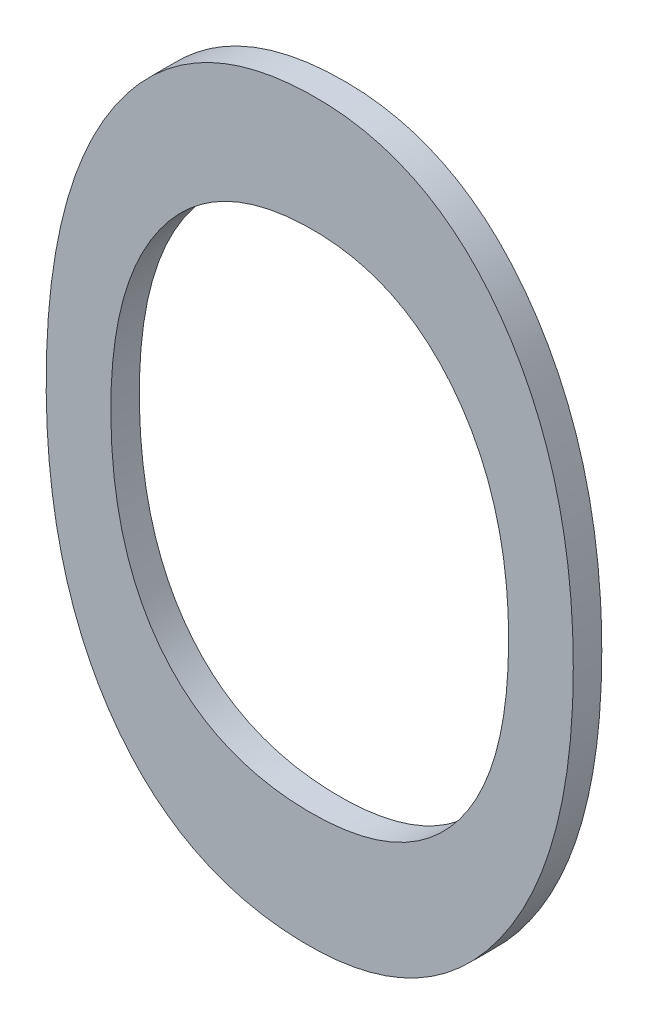
ISO-10303-21;
HEADER;
FILE_DESCRIPTION(('STEP AP214'),'2;1');
FILE_NAME('part.step','',(''),(''),'','','');
FILE_SCHEMA(('AUTOMOTIVE_DESIGN { 1 0 10303 214 1 1 1 1 }'));
ENDSEC;
DATA;
#1=APPLICATION_CONTEXT('core data for automotive mechanical design processes');
#2=APPLICATION_PROTOCOL_DEFINITION('international standard','automotive_design',2000,#1);
#3=PRODUCT_CONTEXT('',#1,'mechanical');
#4=PRODUCT('Part','Part','',(#3));
#5=PRODUCT_RELATED_PRODUCT_CATEGORY('part','',(#4));
#6=PRODUCT_DEFINITION_FORMATION('','',#4);
#7=PRODUCT_DEFINITION_CONTEXT('part definition',#1,'design');
#8=PRODUCT_DEFINITION('design','',#6,#7);
#9=PRODUCT_DEFINITION_SHAPE('','',#8);
#10=(LENGTH_UNIT() NAMED_UNIT(*) SI_UNIT(.MILLI.,.METRE.));
#11=(NAMED_UNIT(*) PLANE_ANGLE_UNIT() SI_UNIT($,.RADIAN.));
#12=(NAMED_UNIT(*) SI_UNIT($,.STERADIAN.) SOLID_ANGLE_UNIT());
#13=UNCERTAINTY_MEASURE_WITH_UNIT(LENGTH_MEASURE(1.E-05),#10,'distance_accuracy_value','');
#14=(GEOMETRIC_REPRESENTATION_CONTEXT(3) GLOBAL_UNCERTAINTY_ASSIGNED_CONTEXT((#13)) GLOBAL_UNIT_ASSIGNED_CONTEXT((#10,
#11,#12)) REPRESENTATION_CONTEXT('',''));
#15=CARTESIAN_POINT('',(0.,0.,0.));
#16=DIRECTION('',(0.,0.,1.));
#17=DIRECTION('',(1.,0.,0.));
#18=AXIS2_PLACEMENT_3D('',#15,#16,#17);
#19=CARTESIAN_POINT('',(-8.95983005625009,-22.770458436575,135.210489149433));
#20=DIRECTION('',(0.,0.,-1.));
#21=DIRECTION('',(0.,-1.,0.));
#22=AXIS2_PLACEMENT_3D('',#19,#20,#21);
#23=PLANE('',#22);
#24=CARTESIAN_POINT('',(-6.29001147151449,-16.1532340899975,135.210489149433));
#25=CARTESIAN_POINT('',(-6.29001147151449,-15.0086839342638,135.210489149433));
#26=CARTESIAN_POINT('',(-6.5358426870482,-14.0832271760532,135.210489149433));
#27=CARTESIAN_POINT('',(-7.51916511930408,-12.6704975235066,135.210489149433));
#28=CARTESIAN_POINT('',(-8.17524647300516,-12.3173154314269,135.210489149433));
#29=CARTESIAN_POINT('',(-9.87690675396641,-12.3173154314269,135.210489149433));
#30=CARTESIAN_POINT('',(-10.5705007487846,-12.6776808085986,135.210489149433));
#31=CARTESIAN_POINT('',(-11.5825575457215,-14.1191435755737,135.210489149433));
#32=CARTESIAN_POINT('',(-11.8355718681491,-15.09967336073,135.210489149433));
#33=CARTESIAN_POINT('',(-11.8355718681491,-17.508496133783,135.210489149433));
#34=CARTESIAN_POINT('',(-11.5913376108739,-18.4243758007808,135.210489149433));
#35=CARTESIAN_POINT('',(-10.6143992419472,-19.7509041122811,135.210489149433));
#36=CARTESIAN_POINT('',(-9.93916261334142,-20.0825366603933,135.210489149433));
#37=CARTESIAN_POINT('',(-8.24069481584198,-20.0825366603933,135.210489149433));
#38=CARTESIAN_POINT('',(-7.56705473886371,-19.7233678875259,135.210489149433));
#39=CARTESIAN_POINT('',(-6.54541987593813,-18.2866945630375,135.210489149433));
#40=CARTESIAN_POINT('',(-6.29001147151449,-17.3360952924369,135.210489149433));
#41=CARTESIAN_POINT('',(-6.29001147151449,-16.1532340899975,135.210489149433));
#42=(BOUNDED_CURVE() B_SPLINE_CURVE(3,(#24,#25,#26,#27,#28,#29,#30,#31,#32,#33,#34,#35,#36,#37,
#38,#39,#40,#41),.UNSPECIFIED.,.T.,.F.) B_SPLINE_CURVE_WITH_KNOTS((4,2,2,2,2,2,2,2,4),(0.,
0.122928190053667,0.245856351944826,0.377872553464439,0.509888688329001,0.634259060932158,
0.758629365308048,0.879314652967576,1.),
.UNSPECIFIED.) CURVE() GEOMETRIC_REPRESENTATION_ITEM() RATIONAL_B_SPLINE_CURVE((1.,1.,1.,1.,1.,
1.,1.,1.,1.,1.,1.,1.,1.,1.,1.,1.,1.,1.)) REPRESENTATION_ITEM(''));
#43=CARTESIAN_POINT('',(-6.29001147151449,-16.1532340899975,135.210489149433));
#44=VERTEX_POINT('',#43);
#45=EDGE_CURVE('E11',#44,#44,#42,.T.);
#46=ORIENTED_EDGE('',*,*,#45,.T.);
#47=EDGE_LOOP('',(#46));
#48=FACE_BOUND('',#47,.T.);
#49=CARTESIAN_POINT('',(-6.97003701237988,-16.2394345545145,135.210489149433));
#50=CARTESIAN_POINT('',(-6.97003701237988,-17.072705305225,135.210489149433));
#51=CARTESIAN_POINT('',(-7.15201513136967,-17.7180112932844,135.210489149433));
#52=CARTESIAN_POINT('',(-7.8799303417068,-18.6326927255271,135.210489149433));
#53=CARTESIAN_POINT('',(-8.39074752468784,-18.8613645820936,135.210489149433));
#54=CARTESIAN_POINT('',(-9.72206513286093,-18.8613634729907,135.210489149433));
#55=CARTESIAN_POINT('',(-10.2416626137619,-18.6350877731961,135.210489149433));
#56=CARTESIAN_POINT('',(-10.9727692599526,-17.7299835128572,135.210489149433));
#57=CARTESIAN_POINT('',(-11.1555467101181,-17.0822827556104,135.210489149433));
#58=CARTESIAN_POINT('',(-11.1555459531499,-15.4157415698645,135.210489149433));
#59=CARTESIAN_POINT('',(-10.9663841527485,-14.7596605027091,135.210489149433));
#60=CARTESIAN_POINT('',(-10.2097361560097,-13.7827225828692,135.210489149433));
#61=CARTESIAN_POINT('',(-9.69013917584141,-13.5384880576288,135.210489149433));
#62=CARTESIAN_POINT('',(-8.4035178326689,-13.5384880576288,135.210489149433));
#63=CARTESIAN_POINT('',(-7.90387503822888,-13.7839197267693,135.210489149433));
#64=CARTESIAN_POINT('',(-7.15680459050488,-14.7656467306218,135.210489149433));
#65=CARTESIAN_POINT('',(-6.97003701237988,-15.4205305756577,135.210489149433));
#66=CARTESIAN_POINT('',(-6.97003701237988,-16.2394345545145,135.210489149433));
#67=(BOUNDED_CURVE() B_SPLINE_CURVE(3,(#49,#50,#51,#52,#53,#54,#55,#56,#57,#58,#59,#60,#61,#62,
#63,#64,#65,#66),.UNSPECIFIED.,.T.,.F.) B_SPLINE_CURVE_WITH_KNOTS((4,2,2,2,2,2,2,2,4),(0.,
0.125847552098494,0.251694915101053,0.380596777442791,0.509498684426021,0.635471067533667,
0.761443497351189,0.880721770265637,1.),
.UNSPECIFIED.) CURVE() GEOMETRIC_REPRESENTATION_ITEM() RATIONAL_B_SPLINE_CURVE((1.,1.,1.,1.,1.,
1.,1.,1.,1.,1.,1.,1.,1.,1.,1.,1.,1.,1.)) REPRESENTATION_ITEM(''));
#68=CARTESIAN_POINT('',(-6.97003701237988,-16.2394345545145,135.210489149433));
#69=VERTEX_POINT('',#68);
#70=EDGE_CURVE('E64',#69,#69,#67,.T.);
#71=ORIENTED_EDGE('',*,*,#70,.T.);
#72=EDGE_LOOP('',(#71));
#73=FACE_BOUND('',#72,.T.);
#74=ADVANCED_FACE('F43',(#48,#73),#23,.F.);
#75=CARTESIAN_POINT('',(-6.29001147151449,-16.1532340899975,135.410489149433));
#76=CARTESIAN_POINT('',(-6.29001147151449,-15.0086839342638,135.410489149433));
#77=CARTESIAN_POINT('',(-6.5358426870482,-14.0832271760532,135.410489149433));
#78=CARTESIAN_POINT('',(-7.51916511930408,-12.6704975235066,135.410489149433));
#79=CARTESIAN_POINT('',(-8.17524647300516,-12.3173154314269,135.410489149433));
#80=CARTESIAN_POINT('',(-9.87690675396641,-12.3173154314269,135.410489149433));
#81=CARTESIAN_POINT('',(-10.5705007487846,-12.6776808085986,135.410489149433));
#82=CARTESIAN_POINT('',(-11.5825575457215,-14.1191435755737,135.410489149433));
#83=CARTESIAN_POINT('',(-11.8355718681491,-15.09967336073,135.410489149433));
#84=CARTESIAN_POINT('',(-11.8355718681491,-17.508496133783,135.410489149433));
#85=CARTESIAN_POINT('',(-11.5913376108739,-18.4243758007808,135.410489149433));
#86=CARTESIAN_POINT('',(-10.6143992419472,-19.7509041122811,135.410489149433));
#87=CARTESIAN_POINT('',(-9.93916261334142,-20.0825366603933,135.410489149433));
#88=CARTESIAN_POINT('',(-8.24069481584198,-20.0825366603933,135.410489149433));
#89=CARTESIAN_POINT('',(-7.56705473886371,-19.7233678875259,135.410489149433));
#90=CARTESIAN_POINT('',(-6.54541987593813,-18.2866945630375,135.410489149433));
#91=CARTESIAN_POINT('',(-6.29001147151449,-17.3360952924369,135.410489149433));
#92=CARTESIAN_POINT('',(-6.29001147151449,-16.1532340899975,135.410489149433));
#93=(BOUNDED_CURVE() B_SPLINE_CURVE(3,(#75,#76,#77,#78,#79,#80,#81,#82,#83,#84,#85,#86,#87,#88,
#89,#90,#91,#92),.UNSPECIFIED.,.T.,.F.) B_SPLINE_CURVE_WITH_KNOTS((4,2,2,2,2,2,2,2,4),(0.,
0.122928190053667,0.245856351944826,0.377872553464439,0.509888688329001,0.634259060932158,
0.758629365308048,0.879314652967576,1.),
.UNSPECIFIED.) CURVE() GEOMETRIC_REPRESENTATION_ITEM() RATIONAL_B_SPLINE_CURVE((1.,1.,1.,1.,1.,
1.,1.,1.,1.,1.,1.,1.,1.,1.,1.,1.,1.,1.)) REPRESENTATION_ITEM(''));
#94=DIRECTION('',(0.,0.,-1.));
#95=VECTOR('',#94,1.);
#96=SURFACE_OF_LINEAR_EXTRUSION('',#93,#95);
#97=ORIENTED_EDGE('',*,*,#45,.F.);
#98=EDGE_LOOP('',(#97));
#99=FACE_BOUND('',#98,.T.);
#100=CARTESIAN_POINT('',(-6.29001147151449,-16.1532340899975,134.910489149433));
#101=CARTESIAN_POINT('',(-6.29001147151449,-17.3360952924369,134.910489149433));
#102=CARTESIAN_POINT('',(-6.54541987593813,-18.2866945630375,134.910489149433));
#103=CARTESIAN_POINT('',(-7.56705473886371,-19.7233678875259,134.910489149433));
#104=CARTESIAN_POINT('',(-8.24069481584198,-20.0825366603933,134.910489149433));
#105=CARTESIAN_POINT('',(-9.93916261334142,-20.0825366603933,134.910489149433));
#106=CARTESIAN_POINT('',(-10.6143992419472,-19.7509041122811,134.910489149433));
#107=CARTESIAN_POINT('',(-11.5913376108739,-18.4243758007808,134.910489149433));
#108=CARTESIAN_POINT('',(-11.8355718681491,-17.508496133783,134.910489149433));
#109=CARTESIAN_POINT('',(-11.8355718681491,-15.09967336073,134.910489149433));
#110=CARTESIAN_POINT('',(-11.5825575457215,-14.1191435755737,134.910489149433));
#111=CARTESIAN_POINT('',(-10.5705007487846,-12.6776808085986,134.910489149433));
#112=CARTESIAN_POINT('',(-9.87690675396641,-12.3173154314269,134.910489149433));
#113=CARTESIAN_POINT('',(-8.17524647300516,-12.3173154314269,134.910489149433));
#114=CARTESIAN_POINT('',(-7.51916511930408,-12.6704975235066,134.910489149433));
#115=CARTESIAN_POINT('',(-6.5358426870482,-14.0832271760532,134.910489149433));
#116=CARTESIAN_POINT('',(-6.29001147151449,-15.0086839342638,134.910489149433));
#117=CARTESIAN_POINT('',(-6.29001147151449,-16.1532340899975,134.910489149433));
#118=(BOUNDED_CURVE() B_SPLINE_CURVE(3,(#100,#101,#102,#103,#104,#105,#106,#107,#108,#109,#110,
#111,#112,#113,#114,#115,#116,#117),.UNSPECIFIED.,.T.,.F.) B_SPLINE_CURVE_WITH_KNOTS((4,2,2,2,2,
2,2,2,4),(0.,0.120685347032424,0.241370634691952,0.365740939067842,0.490111311670999,
0.622127446535561,0.754143648055174,0.877071809946333,1.),
.UNSPECIFIED.) CURVE() GEOMETRIC_REPRESENTATION_ITEM() RATIONAL_B_SPLINE_CURVE((1.,1.,1.,1.,1.,
1.,1.,1.,1.,1.,1.,1.,1.,1.,1.,1.,1.,1.)) REPRESENTATION_ITEM(''));
#119=CARTESIAN_POINT('',(-6.29001147151449,-16.1532340899975,134.910489149433));
#120=VERTEX_POINT('',#119);
#121=EDGE_CURVE('E53',#120,#120,#118,.T.);
#122=ORIENTED_EDGE('',*,*,#121,.F.);
#123=EDGE_LOOP('',(#122));
#124=FACE_BOUND('',#123,.T.);
#125=ADVANCED_FACE('F99',(#99,#124),#96,.F.);
#126=CARTESIAN_POINT('',(-11.8313130441182,-16.0656538443914,134.910489149433));
#127=DIRECTION('',(0.,0.,1.));
#128=DIRECTION('',(1.,0.,0.));
#129=AXIS2_PLACEMENT_3D('',#126,#127,#128);
#130=PLANE('',#129);
#131=ORIENTED_EDGE('',*,*,#121,.T.);
#132=EDGE_LOOP('',(#131));
#133=FACE_BOUND('',#132,.T.);
#134=CARTESIAN_POINT('',(-6.97003701237988,-16.2394345545145,134.910489149433));
#135=CARTESIAN_POINT('',(-6.97003701237988,-15.4205305756577,134.910489149433));
#136=CARTESIAN_POINT('',(-7.15680459050488,-14.7656467306218,134.910489149433));
#137=CARTESIAN_POINT('',(-7.90387503822888,-13.7839197267693,134.910489149433));
#138=CARTESIAN_POINT('',(-8.4035178326689,-13.5384880576288,134.910489149433));
#139=CARTESIAN_POINT('',(-9.69013917584141,-13.5384880576288,134.910489149433));
#140=CARTESIAN_POINT('',(-10.2097361560097,-13.7827225828692,134.910489149433));
#141=CARTESIAN_POINT('',(-10.9663841527485,-14.7596605027091,134.910489149433));
#142=CARTESIAN_POINT('',(-11.1555459531499,-15.4157415698645,134.910489149433));
#143=CARTESIAN_POINT('',(-11.1555467101181,-17.0822827556104,134.910489149433));
#144=CARTESIAN_POINT('',(-10.9727692599526,-17.7299835128572,134.910489149433));
#145=CARTESIAN_POINT('',(-10.2416626137619,-18.6350877731961,134.910489149433));
#146=CARTESIAN_POINT('',(-9.72206513286093,-18.8613634729907,134.910489149433));
#147=CARTESIAN_POINT('',(-8.39074752468784,-18.8613645820936,134.910489149433));
#148=CARTESIAN_POINT('',(-7.8799303417068,-18.6326927255271,134.910489149433));
#149=CARTESIAN_POINT('',(-7.15201513136967,-17.7180112932844,134.910489149433));
#150=CARTESIAN_POINT('',(-6.97003701237988,-17.072705305225,134.910489149433));
#151=CARTESIAN_POINT('',(-6.97003701237988,-16.2394345545145,134.910489149433));
#152=(BOUNDED_CURVE() B_SPLINE_CURVE(3,(#134,#135,#136,#137,#138,#139,#140,#141,#142,#143,#144,
#145,#146,#147,#148,#149,#150,#151),.UNSPECIFIED.,.T.,.F.) B_SPLINE_CURVE_WITH_KNOTS((4,2,2,2,2,
2,2,2,4),(0.,0.119278229734363,0.238556502648811,0.364528932466333,0.490501315573979,
0.619403222557209,0.748305084898947,0.874152447901506,1.),
.UNSPECIFIED.) CURVE() GEOMETRIC_REPRESENTATION_ITEM() RATIONAL_B_SPLINE_CURVE((1.,1.,1.,1.,1.,
1.,1.,1.,1.,1.,1.,1.,1.,1.,1.,1.,1.,1.)) REPRESENTATION_ITEM(''));
#153=CARTESIAN_POINT('',(-6.97003701237988,-16.2394345545145,134.910489149433));
#154=VERTEX_POINT('',#153);
#155=EDGE_CURVE('E68',#154,#154,#152,.T.);
#156=ORIENTED_EDGE('',*,*,#155,.T.);
#157=EDGE_LOOP('',(#156));
#158=FACE_BOUND('',#157,.T.);
#159=ADVANCED_FACE('F69',(#133,#158),#130,.F.);
#160=CARTESIAN_POINT('',(-6.97003701237988,-16.2394345545145,135.410489149433));
#161=CARTESIAN_POINT('',(-6.97003701237988,-17.072705305225,135.410489149433));
#162=CARTESIAN_POINT('',(-7.15201513136967,-17.7180112932844,135.410489149433));
#163=CARTESIAN_POINT('',(-7.8799303417068,-18.6326927255271,135.410489149433));
#164=CARTESIAN_POINT('',(-8.39074752468784,-18.8613645820936,135.410489149433));
#165=CARTESIAN_POINT('',(-9.72206513286093,-18.8613634729907,135.410489149433));
#166=CARTESIAN_POINT('',(-10.2416626137619,-18.6350877731961,135.410489149433));
#167=CARTESIAN_POINT('',(-10.9727692599526,-17.7299835128572,135.410489149433));
#168=CARTESIAN_POINT('',(-11.1555467101181,-17.0822827556104,135.410489149433));
#169=CARTESIAN_POINT('',(-11.1555459531499,-15.4157415698645,135.410489149433));
#170=CARTESIAN_POINT('',(-10.9663841527485,-14.7596605027091,135.410489149433));
#171=CARTESIAN_POINT('',(-10.2097361560097,-13.7827225828692,135.410489149433));
#172=CARTESIAN_POINT('',(-9.69013917584141,-13.5384880576288,135.410489149433));
#173=CARTESIAN_POINT('',(-8.4035178326689,-13.5384880576288,135.410489149433));
#174=CARTESIAN_POINT('',(-7.90387503822888,-13.7839197267693,135.410489149433));
#175=CARTESIAN_POINT('',(-7.15680459050488,-14.7656467306218,135.410489149433));
#176=CARTESIAN_POINT('',(-6.97003701237988,-15.4205305756577,135.410489149433));
#177=CARTESIAN_POINT('',(-6.97003701237988,-16.2394345545145,135.410489149433));
#178=(BOUNDED_CURVE() B_SPLINE_CURVE(3,(#160,#161,#162,#163,#164,#165,#166,#167,#168,#169,#170,
#171,#172,#173,#174,#175,#176,#177),.UNSPECIFIED.,.T.,.F.) B_SPLINE_CURVE_WITH_KNOTS((4,2,2,2,2,
2,2,2,4),(0.,0.125847552098494,0.251694915101053,0.380596777442791,0.509498684426021,
0.635471067533667,0.761443497351189,0.880721770265637,1.),
.UNSPECIFIED.) CURVE() GEOMETRIC_REPRESENTATION_ITEM() RATIONAL_B_SPLINE_CURVE((1.,1.,1.,1.,1.,
1.,1.,1.,1.,1.,1.,1.,1.,1.,1.,1.,1.,1.)) REPRESENTATION_ITEM(''));
#179=DIRECTION('',(0.,0.,-1.));
#180=VECTOR('',#179,1.);
#181=SURFACE_OF_LINEAR_EXTRUSION('',#178,#180);
#182=ORIENTED_EDGE('',*,*,#70,.F.);
#183=EDGE_LOOP('',(#182));
#184=FACE_BOUND('',#183,.T.);
#185=ORIENTED_EDGE('',*,*,#155,.F.);
#186=EDGE_LOOP('',(#185));
#187=FACE_BOUND('',#186,.T.);
#188=ADVANCED_FACE('F103',(#184,#187),#181,.F.);
#189=CLOSED_SHELL('',(#74,#125,#159,#188));
#190=MANIFOLD_SOLID_BREP('B2',#189);
#191=ADVANCED_BREP_SHAPE_REPRESENTATION('',(#18,#190),#14);
#192=SHAPE_DEFINITION_REPRESENTATION(#9,#191);
ENDSEC;
END-ISO-10303-21;
